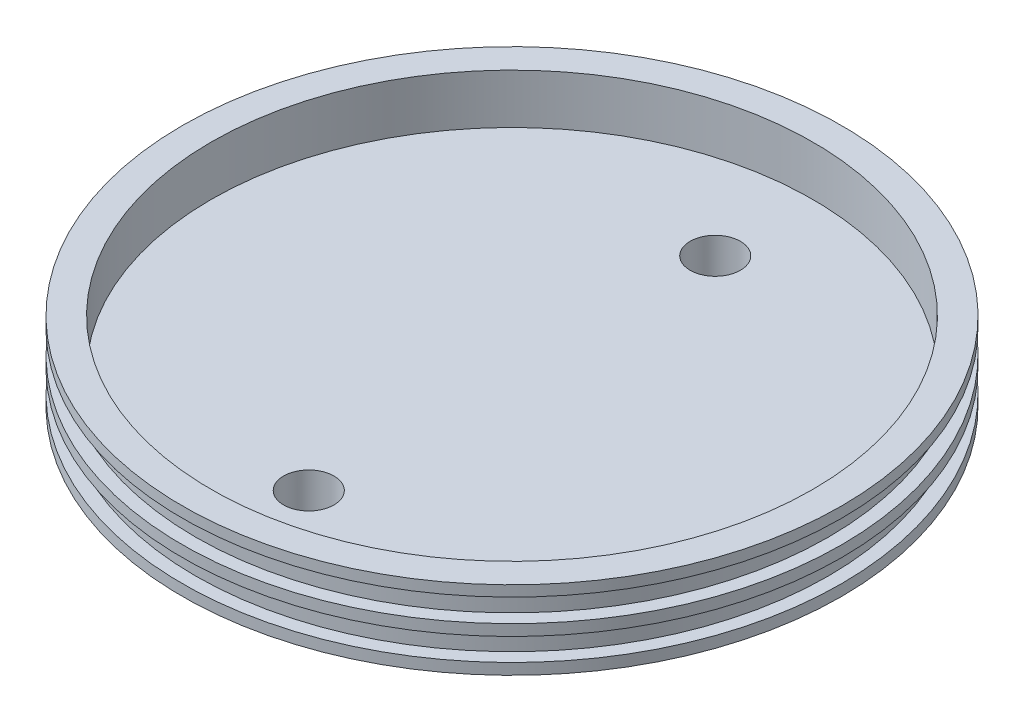
ISO-10303-21;
HEADER;
FILE_DESCRIPTION(('STEP AP214'),'2;1');
FILE_NAME('part.step','',(''),(''),'','','');
FILE_SCHEMA(('AUTOMOTIVE_DESIGN { 1 0 10303 214 1 1 1 1 }'));
ENDSEC;
DATA;
#1=APPLICATION_CONTEXT('core data for automotive mechanical design processes');
#2=APPLICATION_PROTOCOL_DEFINITION('international standard','automotive_design',2000,#1);
#3=PRODUCT_CONTEXT('',#1,'mechanical');
#4=PRODUCT('Part','Part','',(#3));
#5=PRODUCT_RELATED_PRODUCT_CATEGORY('part','',(#4));
#6=PRODUCT_DEFINITION_FORMATION('','',#4);
#7=PRODUCT_DEFINITION_CONTEXT('part definition',#1,'design');
#8=PRODUCT_DEFINITION('design','',#6,#7);
#9=PRODUCT_DEFINITION_SHAPE('','',#8);
#10=(LENGTH_UNIT() NAMED_UNIT(*) SI_UNIT(.MILLI.,.METRE.));
#11=(NAMED_UNIT(*) PLANE_ANGLE_UNIT() SI_UNIT($,.RADIAN.));
#12=(NAMED_UNIT(*) SI_UNIT($,.STERADIAN.) SOLID_ANGLE_UNIT());
#13=UNCERTAINTY_MEASURE_WITH_UNIT(LENGTH_MEASURE(1.E-05),#10,'distance_accuracy_value','');
#14=(GEOMETRIC_REPRESENTATION_CONTEXT(3) GLOBAL_UNCERTAINTY_ASSIGNED_CONTEXT((#13)) GLOBAL_UNIT_ASSIGNED_CONTEXT((#10,
#11,#12)) REPRESENTATION_CONTEXT('',''));
#15=CARTESIAN_POINT('',(0.,0.,0.));
#16=DIRECTION('',(0.,0.,1.));
#17=DIRECTION('',(1.,0.,0.));
#18=AXIS2_PLACEMENT_3D('',#15,#16,#17);
#19=CARTESIAN_POINT('',(0.,0.,0.));
#20=DIRECTION('',(0.,1.,0.));
#21=DIRECTION('',(-1.,0.,0.));
#22=AXIS2_PLACEMENT_3D('',#19,#20,#21);
#23=PLANE('',#22);
#24=CARTESIAN_POINT('',(0.,0.,0.));
#25=DIRECTION('',(0.,-1.,0.));
#26=DIRECTION('',(1.,0.,0.));
#27=AXIS2_PLACEMENT_3D('',#24,#25,#26);
#28=CIRCLE('',#27,66.04);
#29=CARTESIAN_POINT('',(66.04,0.,0.));
#30=VERTEX_POINT('',#29);
#31=EDGE_CURVE('E10',#30,#30,#28,.T.);
#32=ORIENTED_EDGE('',*,*,#31,.F.);
#33=EDGE_LOOP('',(#32));
#34=FACE_BOUND('',#33,.T.);
#35=CARTESIAN_POINT('',(0.,0.,0.));
#36=DIRECTION('',(0.,1.,0.));
#37=DIRECTION('',(-1.,0.,0.));
#38=AXIS2_PLACEMENT_3D('',#35,#36,#37);
#39=CIRCLE('',#38,72.898);
#40=CARTESIAN_POINT('',(-72.898,0.,0.));
#41=VERTEX_POINT('',#40);
#42=EDGE_CURVE('E46',#41,#41,#39,.T.);
#43=ORIENTED_EDGE('',*,*,#42,.F.);
#44=EDGE_LOOP('',(#43));
#45=FACE_BOUND('',#44,.T.);
#46=ADVANCED_FACE('F43',(#34,#45),#23,.F.);
#47=CARTESIAN_POINT('',(0.,48.1922132313012,0.));
#48=DIRECTION('',(0.,1.,0.));
#49=DIRECTION('',(-1.,0.,0.));
#50=AXIS2_PLACEMENT_3D('',#47,#48,#49);
#51=CYLINDRICAL_SURFACE('',#50,72.898);
#52=CARTESIAN_POINT('',(0.,2.4638,0.));
#53=DIRECTION('',(0.,1.,0.));
#54=DIRECTION('',(-1.,0.,0.));
#55=AXIS2_PLACEMENT_3D('',#52,#53,#54);
#56=CIRCLE('',#55,72.898);
#57=CARTESIAN_POINT('',(-72.898,2.46379999999999,0.));
#58=VERTEX_POINT('',#57);
#59=EDGE_CURVE('E56',#58,#58,#56,.T.);
#60=ORIENTED_EDGE('',*,*,#59,.F.);
#61=EDGE_LOOP('',(#60));
#62=FACE_BOUND('',#61,.T.);
#63=ORIENTED_EDGE('',*,*,#42,.T.);
#64=EDGE_LOOP('',(#63));
#65=FACE_BOUND('',#64,.T.);
#66=ADVANCED_FACE('F106',(#62,#65),#51,.T.);
#67=CARTESIAN_POINT('',(72.898,2.4638,0.));
#68=DIRECTION('',(0.,-1.,0.));
#69=DIRECTION('',(1.,0.,0.));
#70=AXIS2_PLACEMENT_3D('',#67,#68,#69);
#71=PLANE('',#70);
#72=CARTESIAN_POINT('',(0.,2.4638,0.));
#73=DIRECTION('',(0.,1.,0.));
#74=DIRECTION('',(-1.,0.,0.));
#75=AXIS2_PLACEMENT_3D('',#72,#73,#74);
#76=CIRCLE('',#75,69.977);
#77=CARTESIAN_POINT('',(-69.977,2.46379999999999,0.));
#78=VERTEX_POINT('',#77);
#79=EDGE_CURVE('E97',#78,#78,#76,.T.);
#80=ORIENTED_EDGE('',*,*,#79,.F.);
#81=EDGE_LOOP('',(#80));
#82=FACE_BOUND('',#81,.T.);
#83=ORIENTED_EDGE('',*,*,#59,.T.);
#84=EDGE_LOOP('',(#83));
#85=FACE_BOUND('',#84,.T.);
#86=ADVANCED_FACE('F104',(#82,#85),#71,.F.);
#87=CARTESIAN_POINT('',(0.,48.1922132313012,0.));
#88=DIRECTION('',(0.,1.,0.));
#89=DIRECTION('',(-1.,0.,0.));
#90=AXIS2_PLACEMENT_3D('',#87,#88,#89);
#91=CYLINDRICAL_SURFACE('',#90,69.977);
#92=CARTESIAN_POINT('',(0.,7.44219999999999,0.));
#93=DIRECTION('',(0.,1.,0.));
#94=DIRECTION('',(-1.,0.,0.));
#95=AXIS2_PLACEMENT_3D('',#92,#93,#94);
#96=CIRCLE('',#95,69.977);
#97=CARTESIAN_POINT('',(-69.977,7.44219999999998,0.));
#98=VERTEX_POINT('',#97);
#99=EDGE_CURVE('E93',#98,#98,#96,.T.);
#100=ORIENTED_EDGE('',*,*,#99,.F.);
#101=EDGE_LOOP('',(#100));
#102=FACE_BOUND('',#101,.T.);
#103=ORIENTED_EDGE('',*,*,#79,.T.);
#104=EDGE_LOOP('',(#103));
#105=FACE_BOUND('',#104,.T.);
#106=ADVANCED_FACE('F239',(#102,#105),#91,.T.);
#107=CARTESIAN_POINT('',(69.977,7.4422,0.));
#108=DIRECTION('',(0.,1.,0.));
#109=DIRECTION('',(-1.,0.,0.));
#110=AXIS2_PLACEMENT_3D('',#107,#108,#109);
#111=PLANE('',#110);
#112=CARTESIAN_POINT('',(0.,7.44219999999999,0.));
#113=DIRECTION('',(0.,1.,0.));
#114=DIRECTION('',(-1.,0.,0.));
#115=AXIS2_PLACEMENT_3D('',#112,#113,#114);
#116=CIRCLE('',#115,72.898);
#117=CARTESIAN_POINT('',(-72.898,7.44219999999998,0.));
#118=VERTEX_POINT('',#117);
#119=EDGE_CURVE('E89',#118,#118,#116,.T.);
#120=ORIENTED_EDGE('',*,*,#119,.F.);
#121=EDGE_LOOP('',(#120));
#122=FACE_BOUND('',#121,.T.);
#123=ORIENTED_EDGE('',*,*,#99,.T.);
#124=EDGE_LOOP('',(#123));
#125=FACE_BOUND('',#124,.T.);
#126=ADVANCED_FACE('F230',(#122,#125),#111,.F.);
#127=CARTESIAN_POINT('',(0.,48.1922132313012,0.));
#128=DIRECTION('',(0.,1.,0.));
#129=DIRECTION('',(-1.,0.,0.));
#130=AXIS2_PLACEMENT_3D('',#127,#128,#129);
#131=CYLINDRICAL_SURFACE('',#130,72.898);
#132=CARTESIAN_POINT('',(0.,9.90599999999999,0.));
#133=DIRECTION('',(0.,1.,0.));
#134=DIRECTION('',(-1.,0.,0.));
#135=AXIS2_PLACEMENT_3D('',#132,#133,#134);
#136=CIRCLE('',#135,72.898);
#137=CARTESIAN_POINT('',(-72.898,9.90599999999998,0.));
#138=VERTEX_POINT('',#137);
#139=EDGE_CURVE('E85',#138,#138,#136,.T.);
#140=ORIENTED_EDGE('',*,*,#139,.F.);
#141=EDGE_LOOP('',(#140));
#142=FACE_BOUND('',#141,.T.);
#143=ORIENTED_EDGE('',*,*,#119,.T.);
#144=EDGE_LOOP('',(#143));
#145=FACE_BOUND('',#144,.T.);
#146=ADVANCED_FACE('F221',(#142,#145),#131,.T.);
#147=CARTESIAN_POINT('',(72.898,9.906,0.));
#148=DIRECTION('',(0.,-1.,0.));
#149=DIRECTION('',(1.,0.,0.));
#150=AXIS2_PLACEMENT_3D('',#147,#148,#149);
#151=PLANE('',#150);
#152=CARTESIAN_POINT('',(0.,9.90599999999999,0.));
#153=DIRECTION('',(0.,1.,0.));
#154=DIRECTION('',(-1.,0.,0.));
#155=AXIS2_PLACEMENT_3D('',#152,#153,#154);
#156=CIRCLE('',#155,69.977);
#157=CARTESIAN_POINT('',(-69.977,9.90599999999998,0.));
#158=VERTEX_POINT('',#157);
#159=EDGE_CURVE('E81',#158,#158,#156,.T.);
#160=ORIENTED_EDGE('',*,*,#159,.F.);
#161=EDGE_LOOP('',(#160));
#162=FACE_BOUND('',#161,.T.);
#163=ORIENTED_EDGE('',*,*,#139,.T.);
#164=EDGE_LOOP('',(#163));
#165=FACE_BOUND('',#164,.T.);
#166=ADVANCED_FACE('F212',(#162,#165),#151,.F.);
#167=CARTESIAN_POINT('',(0.,48.1922132313012,0.));
#168=DIRECTION('',(0.,1.,0.));
#169=DIRECTION('',(-1.,0.,0.));
#170=AXIS2_PLACEMENT_3D('',#167,#168,#169);
#171=CYLINDRICAL_SURFACE('',#170,69.977);
#172=CARTESIAN_POINT('',(0.,14.986,0.));
#173=DIRECTION('',(0.,1.,0.));
#174=DIRECTION('',(-1.,0.,0.));
#175=AXIS2_PLACEMENT_3D('',#172,#173,#174);
#176=CIRCLE('',#175,69.977);
#177=CARTESIAN_POINT('',(-69.977,14.986,0.));
#178=VERTEX_POINT('',#177);
#179=EDGE_CURVE('E77',#178,#178,#176,.T.);
#180=ORIENTED_EDGE('',*,*,#179,.F.);
#181=EDGE_LOOP('',(#180));
#182=FACE_BOUND('',#181,.T.);
#183=ORIENTED_EDGE('',*,*,#159,.T.);
#184=EDGE_LOOP('',(#183));
#185=FACE_BOUND('',#184,.T.);
#186=ADVANCED_FACE('F203',(#182,#185),#171,.T.);
#187=CARTESIAN_POINT('',(69.977,14.986,0.));
#188=DIRECTION('',(0.,1.,0.));
#189=DIRECTION('',(-1.,0.,0.));
#190=AXIS2_PLACEMENT_3D('',#187,#188,#189);
#191=PLANE('',#190);
#192=CARTESIAN_POINT('',(0.,14.986,0.));
#193=DIRECTION('',(0.,1.,0.));
#194=DIRECTION('',(-1.,0.,0.));
#195=AXIS2_PLACEMENT_3D('',#192,#193,#194);
#196=CIRCLE('',#195,72.898);
#197=CARTESIAN_POINT('',(-72.898,14.986,0.));
#198=VERTEX_POINT('',#197);
#199=EDGE_CURVE('E73',#198,#198,#196,.T.);
#200=ORIENTED_EDGE('',*,*,#199,.F.);
#201=EDGE_LOOP('',(#200));
#202=FACE_BOUND('',#201,.T.);
#203=ORIENTED_EDGE('',*,*,#179,.T.);
#204=EDGE_LOOP('',(#203));
#205=FACE_BOUND('',#204,.T.);
#206=ADVANCED_FACE('F194',(#202,#205),#191,.F.);
#207=CARTESIAN_POINT('',(0.,48.1922132313012,0.));
#208=DIRECTION('',(0.,1.,0.));
#209=DIRECTION('',(-1.,0.,0.));
#210=AXIS2_PLACEMENT_3D('',#207,#208,#209);
#211=CYLINDRICAL_SURFACE('',#210,72.898);
#212=CARTESIAN_POINT('',(0.,17.3482,0.));
#213=DIRECTION('',(0.,1.,0.));
#214=DIRECTION('',(-1.,0.,0.));
#215=AXIS2_PLACEMENT_3D('',#212,#213,#214);
#216=CIRCLE('',#215,72.898);
#217=CARTESIAN_POINT('',(-72.898,17.3482,0.));
#218=VERTEX_POINT('',#217);
#219=EDGE_CURVE('E69',#218,#218,#216,.T.);
#220=ORIENTED_EDGE('',*,*,#219,.F.);
#221=EDGE_LOOP('',(#220));
#222=FACE_BOUND('',#221,.T.);
#223=ORIENTED_EDGE('',*,*,#199,.T.);
#224=EDGE_LOOP('',(#223));
#225=FACE_BOUND('',#224,.T.);
#226=ADVANCED_FACE('F185',(#222,#225),#211,.T.);
#227=CARTESIAN_POINT('',(72.898,17.3482,0.));
#228=DIRECTION('',(0.,-1.,0.));
#229=DIRECTION('',(1.,0.,0.));
#230=AXIS2_PLACEMENT_3D('',#227,#228,#229);
#231=PLANE('',#230);
#232=CARTESIAN_POINT('',(0.,17.3482,0.));
#233=DIRECTION('',(0.,1.,0.));
#234=DIRECTION('',(-1.,0.,0.));
#235=AXIS2_PLACEMENT_3D('',#232,#233,#234);
#236=CIRCLE('',#235,66.548);
#237=CARTESIAN_POINT('',(-66.548,17.3482,0.));
#238=VERTEX_POINT('',#237);
#239=EDGE_CURVE('E65',#238,#238,#236,.T.);
#240=ORIENTED_EDGE('',*,*,#239,.F.);
#241=EDGE_LOOP('',(#240));
#242=FACE_BOUND('',#241,.T.);
#243=ORIENTED_EDGE('',*,*,#219,.T.);
#244=EDGE_LOOP('',(#243));
#245=FACE_BOUND('',#244,.T.);
#246=ADVANCED_FACE('F177',(#242,#245),#231,.F.);
#247=CARTESIAN_POINT('',(0.,48.1922132313012,0.));
#248=DIRECTION('',(0.,1.,0.));
#249=DIRECTION('',(-1.,0.,0.));
#250=AXIS2_PLACEMENT_3D('',#247,#248,#249);
#251=CYLINDRICAL_SURFACE('',#250,66.548);
#252=CARTESIAN_POINT('',(0.,6.34999999999999,0.));
#253=DIRECTION('',(0.,1.,0.));
#254=DIRECTION('',(-1.,0.,0.));
#255=AXIS2_PLACEMENT_3D('',#252,#253,#254);
#256=CIRCLE('',#255,66.548);
#257=CARTESIAN_POINT('',(-66.548,6.34999999999999,0.));
#258=VERTEX_POINT('',#257);
#259=EDGE_CURVE('E61',#258,#258,#256,.T.);
#260=ORIENTED_EDGE('',*,*,#259,.F.);
#261=EDGE_LOOP('',(#260));
#262=FACE_BOUND('',#261,.T.);
#263=ORIENTED_EDGE('',*,*,#239,.T.);
#264=EDGE_LOOP('',(#263));
#265=FACE_BOUND('',#264,.T.);
#266=ADVANCED_FACE('F121',(#262,#265),#251,.F.);
#267=CARTESIAN_POINT('',(66.548,6.35,0.));
#268=DIRECTION('',(0.,-1.,0.));
#269=DIRECTION('',(1.,0.,0.));
#270=AXIS2_PLACEMENT_3D('',#267,#268,#269);
#271=PLANE('',#270);
#272=CARTESIAN_POINT('',(0.,6.34999999999999,44.958));
#273=DIRECTION('',(0.,-1.,0.));
#274=DIRECTION('',(1.,0.,0.));
#275=AXIS2_PLACEMENT_3D('',#272,#273,#274);
#276=CIRCLE('',#275,5.56259999999999);
#277=CARTESIAN_POINT('',(5.56259999999999,6.35,44.958));
#278=VERTEX_POINT('',#277);
#279=EDGE_CURVE('E300',#278,#278,#276,.T.);
#280=ORIENTED_EDGE('',*,*,#279,.T.);
#281=EDGE_LOOP('',(#280));
#282=FACE_BOUND('',#281,.T.);
#283=CARTESIAN_POINT('',(0.,6.34999999999999,-44.958));
#284=DIRECTION('',(0.,-1.,0.));
#285=DIRECTION('',(1.,0.,0.));
#286=AXIS2_PLACEMENT_3D('',#283,#284,#285);
#287=CIRCLE('',#286,5.56259999999999);
#288=CARTESIAN_POINT('',(5.56259999999999,6.35,-44.958));
#289=VERTEX_POINT('',#288);
#290=EDGE_CURVE('E307',#289,#289,#287,.T.);
#291=ORIENTED_EDGE('',*,*,#290,.T.);
#292=EDGE_LOOP('',(#291));
#293=FACE_BOUND('',#292,.T.);
#294=ORIENTED_EDGE('',*,*,#259,.T.);
#295=EDGE_LOOP('',(#294));
#296=FACE_BOUND('',#295,.T.);
#297=ADVANCED_FACE('F130',(#282,#293,#296),#271,.F.);
#298=CARTESIAN_POINT('',(0.,-2.54,0.));
#299=DIRECTION('',(0.,1.,0.));
#300=DIRECTION('',(-1.,0.,0.));
#301=AXIS2_PLACEMENT_3D('',#298,#299,#300);
#302=CYLINDRICAL_SURFACE('',#301,66.04);
#303=CARTESIAN_POINT('',(0.,-2.54,0.));
#304=DIRECTION('',(0.,-1.,0.));
#305=DIRECTION('',(1.,0.,0.));
#306=AXIS2_PLACEMENT_3D('',#303,#304,#305);
#307=CIRCLE('',#306,66.04);
#308=CARTESIAN_POINT('',(66.04,-2.53999999999999,0.));
#309=VERTEX_POINT('',#308);
#310=EDGE_CURVE('E59',#309,#309,#307,.T.);
#311=ORIENTED_EDGE('',*,*,#310,.F.);
#312=EDGE_LOOP('',(#311));
#313=FACE_BOUND('',#312,.T.);
#314=ORIENTED_EDGE('',*,*,#31,.T.);
#315=EDGE_LOOP('',(#314));
#316=FACE_BOUND('',#315,.T.);
#317=ADVANCED_FACE('F125',(#313,#316),#302,.T.);
#318=CARTESIAN_POINT('',(0.,-2.54,0.));
#319=DIRECTION('',(0.,-1.,0.));
#320=DIRECTION('',(1.,0.,0.));
#321=AXIS2_PLACEMENT_3D('',#318,#319,#320);
#322=PLANE('',#321);
#323=CARTESIAN_POINT('',(0.,-2.54,44.958));
#324=DIRECTION('',(0.,-1.,0.));
#325=DIRECTION('',(0.,0.,-1.));
#326=AXIS2_PLACEMENT_3D('',#323,#324,#325);
#327=CIRCLE('',#326,5.56259999999999);
#328=CARTESIAN_POINT('',(0.,-2.54,39.3954));
#329=VERTEX_POINT('',#328);
#330=EDGE_CURVE('E297',#329,#329,#327,.T.);
#331=ORIENTED_EDGE('',*,*,#330,.F.);
#332=EDGE_LOOP('',(#331));
#333=FACE_BOUND('',#332,.T.);
#334=CARTESIAN_POINT('',(0.,-2.54,-44.958));
#335=DIRECTION('',(0.,-1.,0.));
#336=DIRECTION('',(0.,0.,-1.));
#337=AXIS2_PLACEMENT_3D('',#334,#335,#336);
#338=CIRCLE('',#337,5.56259999999999);
#339=CARTESIAN_POINT('',(0.,-2.54,-50.5206));
#340=VERTEX_POINT('',#339);
#341=EDGE_CURVE('E302',#340,#340,#338,.T.);
#342=ORIENTED_EDGE('',*,*,#341,.F.);
#343=EDGE_LOOP('',(#342));
#344=FACE_BOUND('',#343,.T.);
#345=ORIENTED_EDGE('',*,*,#310,.T.);
#346=EDGE_LOOP('',(#345));
#347=FACE_BOUND('',#346,.T.);
#348=ADVANCED_FACE('F129',(#333,#344,#347),#322,.T.);
#349=CARTESIAN_POINT('',(0.,-2.54,-44.958));
#350=DIRECTION('',(0.,-1.,0.));
#351=DIRECTION('',(0.,0.,-1.));
#352=AXIS2_PLACEMENT_3D('',#349,#350,#351);
#353=CYLINDRICAL_SURFACE('',#352,5.56259999999999);
#354=ORIENTED_EDGE('',*,*,#341,.T.);
#355=EDGE_LOOP('',(#354));
#356=FACE_BOUND('',#355,.T.);
#357=ORIENTED_EDGE('',*,*,#290,.F.);
#358=EDGE_LOOP('',(#357));
#359=FACE_BOUND('',#358,.T.);
#360=ADVANCED_FACE('F138',(#356,#359),#353,.F.);
#361=CARTESIAN_POINT('',(0.,-2.54,44.958));
#362=DIRECTION('',(0.,-1.,0.));
#363=DIRECTION('',(0.,0.,-1.));
#364=AXIS2_PLACEMENT_3D('',#361,#362,#363);
#365=CYLINDRICAL_SURFACE('',#364,5.56259999999999);
#366=ORIENTED_EDGE('',*,*,#330,.T.);
#367=EDGE_LOOP('',(#366));
#368=FACE_BOUND('',#367,.T.);
#369=ORIENTED_EDGE('',*,*,#279,.F.);
#370=EDGE_LOOP('',(#369));
#371=FACE_BOUND('',#370,.T.);
#372=ADVANCED_FACE('F142',(#368,#371),#365,.F.);
#373=CLOSED_SHELL('',(#46,#66,#86,#106,#126,#146,#166,#186,#206,#226,#246,#266,#297,#317,#348,
#360,#372));
#374=MANIFOLD_SOLID_BREP('B2',#373);
#375=ADVANCED_BREP_SHAPE_REPRESENTATION('',(#18,#374),#14);
#376=SHAPE_DEFINITION_REPRESENTATION(#9,#375);
ENDSEC;
END-ISO-10303-21;
